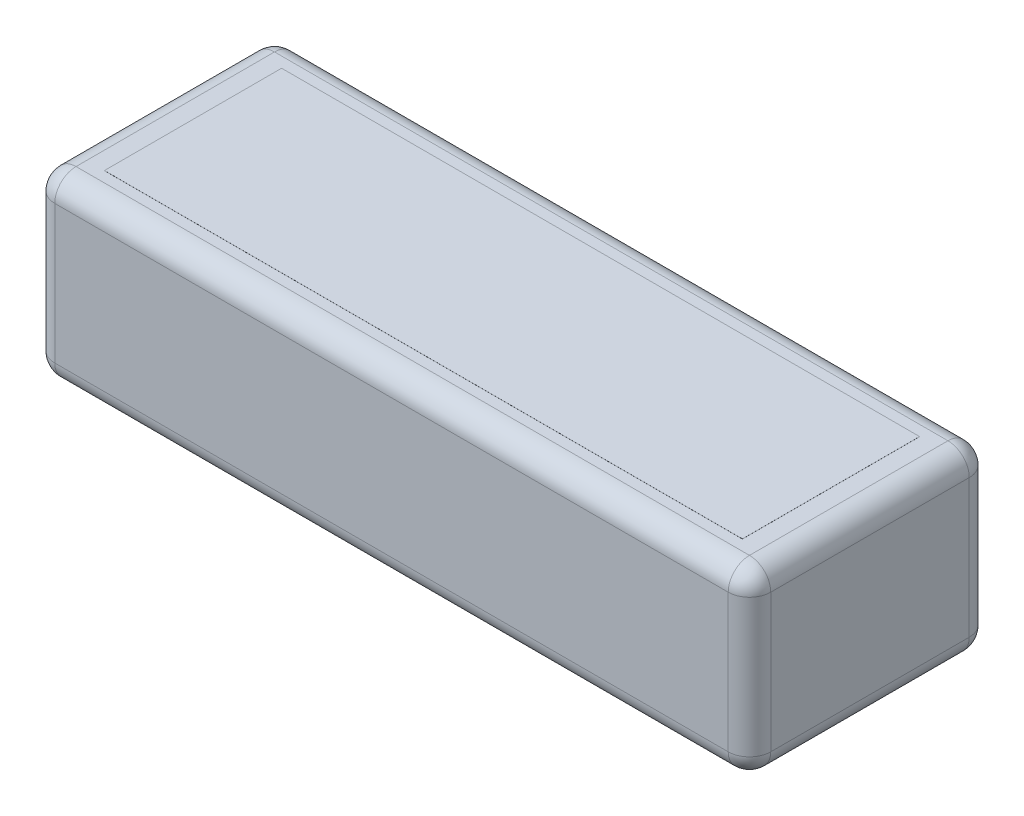
ISO-10303-21;
HEADER;
FILE_DESCRIPTION(('STEP AP214'),'2;1');
FILE_NAME('part.step','',(''),(''),'','','');
FILE_SCHEMA(('AUTOMOTIVE_DESIGN { 1 0 10303 214 1 1 1 1 }'));
ENDSEC;
DATA;
#1=APPLICATION_CONTEXT('core data for automotive mechanical design processes');
#2=APPLICATION_PROTOCOL_DEFINITION('international standard','automotive_design',2000,#1);
#3=PRODUCT_CONTEXT('',#1,'mechanical');
#4=PRODUCT('Part','Part','',(#3));
#5=PRODUCT_RELATED_PRODUCT_CATEGORY('part','',(#4));
#6=PRODUCT_DEFINITION_FORMATION('','',#4);
#7=PRODUCT_DEFINITION_CONTEXT('part definition',#1,'design');
#8=PRODUCT_DEFINITION('design','',#6,#7);
#9=PRODUCT_DEFINITION_SHAPE('','',#8);
#10=(LENGTH_UNIT() NAMED_UNIT(*) SI_UNIT(.MILLI.,.METRE.));
#11=(NAMED_UNIT(*) PLANE_ANGLE_UNIT() SI_UNIT($,.RADIAN.));
#12=(NAMED_UNIT(*) SI_UNIT($,.STERADIAN.) SOLID_ANGLE_UNIT());
#13=UNCERTAINTY_MEASURE_WITH_UNIT(LENGTH_MEASURE(1.E-05),#10,'distance_accuracy_value','');
#14=(GEOMETRIC_REPRESENTATION_CONTEXT(3) GLOBAL_UNCERTAINTY_ASSIGNED_CONTEXT((#13)) GLOBAL_UNIT_ASSIGNED_CONTEXT((#10,
#11,#12)) REPRESENTATION_CONTEXT('',''));
#15=CARTESIAN_POINT('',(0.,0.,0.));
#16=DIRECTION('',(0.,0.,1.));
#17=DIRECTION('',(1.,0.,0.));
#18=AXIS2_PLACEMENT_3D('',#15,#16,#17);
#19=CARTESIAN_POINT('',(0.,25.5,0.));
#20=DIRECTION('',(0.,1.,0.));
#21=DIRECTION('',(0.,0.,1.));
#22=AXIS2_PLACEMENT_3D('',#19,#20,#21);
#23=PLANE('',#22);
#24=DIRECTION('',(-1.,0.,0.));
#25=VECTOR('',#24,1.);
#26=CARTESIAN_POINT('',(-50.5,25.5,-14.));
#27=LINE('',#26,#25);
#28=CARTESIAN_POINT('',(47.5,25.5,-14.));
#29=VERTEX_POINT('',#28);
#30=CARTESIAN_POINT('',(-47.5,25.5,-14.));
#31=VERTEX_POINT('',#30);
#32=EDGE_CURVE('E41',#29,#31,#27,.T.);
#33=ORIENTED_EDGE('',*,*,#32,.T.);
#34=DIRECTION('',(0.,0.,1.));
#35=VECTOR('',#34,1.);
#36=CARTESIAN_POINT('',(-47.5,25.5,17.));
#37=LINE('',#36,#35);
#38=CARTESIAN_POINT('',(-47.5,25.5,14.));
#39=VERTEX_POINT('',#38);
#40=EDGE_CURVE('E11',#31,#39,#37,.T.);
#41=ORIENTED_EDGE('',*,*,#40,.T.);
#42=DIRECTION('',(1.,0.,0.));
#43=VECTOR('',#42,1.);
#44=CARTESIAN_POINT('',(50.5,25.5,14.));
#45=LINE('',#44,#43);
#46=CARTESIAN_POINT('',(47.5,25.5,14.));
#47=VERTEX_POINT('',#46);
#48=EDGE_CURVE('E219',#39,#47,#45,.T.);
#49=ORIENTED_EDGE('',*,*,#48,.T.);
#50=DIRECTION('',(0.,0.,-1.));
#51=VECTOR('',#50,1.);
#52=CARTESIAN_POINT('',(47.5,25.5,-17.));
#53=LINE('',#52,#51);
#54=EDGE_CURVE('E52',#47,#29,#53,.T.);
#55=ORIENTED_EDGE('',*,*,#54,.T.);
#56=EDGE_LOOP('',(#33,#41,#49,#55));
#57=FACE_BOUND('',#56,.T.);
#58=DIRECTION('',(1.,0.,0.));
#59=VECTOR('',#58,1.);
#60=CARTESIAN_POINT('',(45.,25.5,12.5));
#61=LINE('',#60,#59);
#62=CARTESIAN_POINT('',(-45.,25.5,12.5));
#63=VERTEX_POINT('',#62);
#64=CARTESIAN_POINT('',(45.,25.5,12.5));
#65=VERTEX_POINT('',#64);
#66=EDGE_CURVE('E294',#63,#65,#61,.T.);
#67=ORIENTED_EDGE('',*,*,#66,.F.);
#68=DIRECTION('',(0.,0.,1.));
#69=VECTOR('',#68,1.);
#70=CARTESIAN_POINT('',(-45.,25.5,12.5));
#71=LINE('',#70,#69);
#72=CARTESIAN_POINT('',(-45.,25.5,-12.5));
#73=VERTEX_POINT('',#72);
#74=EDGE_CURVE('E167',#73,#63,#71,.T.);
#75=ORIENTED_EDGE('',*,*,#74,.F.);
#76=DIRECTION('',(-1.,0.,0.));
#77=VECTOR('',#76,1.);
#78=CARTESIAN_POINT('',(45.,25.5,-12.5));
#79=LINE('',#78,#77);
#80=CARTESIAN_POINT('',(45.,25.5,-12.5));
#81=VERTEX_POINT('',#80);
#82=EDGE_CURVE('E163',#81,#73,#79,.T.);
#83=ORIENTED_EDGE('',*,*,#82,.F.);
#84=DIRECTION('',(0.,0.,-1.));
#85=VECTOR('',#84,1.);
#86=CARTESIAN_POINT('',(45.,25.5,12.5));
#87=LINE('',#86,#85);
#88=EDGE_CURVE('E296',#65,#81,#87,.T.);
#89=ORIENTED_EDGE('',*,*,#88,.F.);
#90=EDGE_LOOP('',(#67,#75,#83,#89));
#91=FACE_BOUND('',#90,.T.);
#92=ADVANCED_FACE('F32',(#57,#91),#23,.T.);
#93=CARTESIAN_POINT('',(-50.5,25.5,17.));
#94=DIRECTION('',(1.,0.,0.));
#95=DIRECTION('',(0.,0.,-1.));
#96=AXIS2_PLACEMENT_3D('',#93,#94,#95);
#97=PLANE('',#96);
#98=DIRECTION('',(0.,-1.,0.));
#99=VECTOR('',#98,1.);
#100=CARTESIAN_POINT('',(-50.5,25.5,-14.));
#101=LINE('',#100,#99);
#102=CARTESIAN_POINT('',(-50.5,22.5,-14.));
#103=VERTEX_POINT('',#102);
#104=CARTESIAN_POINT('',(-50.5,3.,-14.));
#105=VERTEX_POINT('',#104);
#106=EDGE_CURVE('E212',#103,#105,#101,.T.);
#107=ORIENTED_EDGE('',*,*,#106,.T.);
#108=DIRECTION('',(0.,0.,1.));
#109=VECTOR('',#108,1.);
#110=CARTESIAN_POINT('',(-50.5,3.,17.));
#111=LINE('',#110,#109);
#112=CARTESIAN_POINT('',(-50.5,3.,14.));
#113=VERTEX_POINT('',#112);
#114=EDGE_CURVE('E216',#105,#113,#111,.T.);
#115=ORIENTED_EDGE('',*,*,#114,.T.);
#116=DIRECTION('',(0.,-1.,0.));
#117=VECTOR('',#116,1.);
#118=CARTESIAN_POINT('',(-50.5,25.5,14.));
#119=LINE('',#118,#117);
#120=CARTESIAN_POINT('',(-50.5,22.5,14.));
#121=VERTEX_POINT('',#120);
#122=EDGE_CURVE('E214',#113,#121,#119,.F.);
#123=ORIENTED_EDGE('',*,*,#122,.T.);
#124=DIRECTION('',(0.,0.,1.));
#125=VECTOR('',#124,1.);
#126=CARTESIAN_POINT('',(-50.5,22.5,-17.));
#127=LINE('',#126,#125);
#128=EDGE_CURVE('E210',#121,#103,#127,.F.);
#129=ORIENTED_EDGE('',*,*,#128,.T.);
#130=EDGE_LOOP('',(#107,#115,#123,#129));
#131=FACE_BOUND('',#130,.T.);
#132=ADVANCED_FACE('F314',(#131),#97,.F.);
#133=CARTESIAN_POINT('',(50.5,25.5,17.));
#134=DIRECTION('',(0.,0.,-1.));
#135=DIRECTION('',(-1.,0.,0.));
#136=AXIS2_PLACEMENT_3D('',#133,#134,#135);
#137=PLANE('',#136);
#138=DIRECTION('',(0.,-1.,0.));
#139=VECTOR('',#138,1.);
#140=CARTESIAN_POINT('',(-47.5,25.5,17.));
#141=LINE('',#140,#139);
#142=CARTESIAN_POINT('',(-47.5,22.5,17.));
#143=VERTEX_POINT('',#142);
#144=CARTESIAN_POINT('',(-47.5,3.,17.));
#145=VERTEX_POINT('',#144);
#146=EDGE_CURVE('E205',#143,#145,#141,.T.);
#147=ORIENTED_EDGE('',*,*,#146,.T.);
#148=DIRECTION('',(1.,0.,0.));
#149=VECTOR('',#148,1.);
#150=CARTESIAN_POINT('',(50.5,3.,17.));
#151=LINE('',#150,#149);
#152=CARTESIAN_POINT('',(47.5,3.,17.));
#153=VERTEX_POINT('',#152);
#154=EDGE_CURVE('E207',#145,#153,#151,.T.);
#155=ORIENTED_EDGE('',*,*,#154,.T.);
#156=DIRECTION('',(0.,-1.,0.));
#157=VECTOR('',#156,1.);
#158=CARTESIAN_POINT('',(47.5,25.5,17.));
#159=LINE('',#158,#157);
#160=CARTESIAN_POINT('',(47.5,22.5,17.));
#161=VERTEX_POINT('',#160);
#162=EDGE_CURVE('E203',#153,#161,#159,.F.);
#163=ORIENTED_EDGE('',*,*,#162,.T.);
#164=DIRECTION('',(1.,0.,0.));
#165=VECTOR('',#164,1.);
#166=CARTESIAN_POINT('',(-50.5,22.5,17.));
#167=LINE('',#166,#165);
#168=EDGE_CURVE('E201',#161,#143,#167,.F.);
#169=ORIENTED_EDGE('',*,*,#168,.T.);
#170=EDGE_LOOP('',(#147,#155,#163,#169));
#171=FACE_BOUND('',#170,.T.);
#172=ADVANCED_FACE('F319',(#171),#137,.F.);
#173=CARTESIAN_POINT('',(50.5,25.5,17.));
#174=DIRECTION('',(-1.,0.,0.));
#175=DIRECTION('',(0.,0.,1.));
#176=AXIS2_PLACEMENT_3D('',#173,#174,#175);
#177=PLANE('',#176);
#178=DIRECTION('',(0.,-1.,0.));
#179=VECTOR('',#178,1.);
#180=CARTESIAN_POINT('',(50.5,25.5,14.));
#181=LINE('',#180,#179);
#182=CARTESIAN_POINT('',(50.5,22.5,14.));
#183=VERTEX_POINT('',#182);
#184=CARTESIAN_POINT('',(50.5,3.,14.));
#185=VERTEX_POINT('',#184);
#186=EDGE_CURVE('E194',#183,#185,#181,.T.);
#187=ORIENTED_EDGE('',*,*,#186,.T.);
#188=DIRECTION('',(0.,0.,-1.));
#189=VECTOR('',#188,1.);
#190=CARTESIAN_POINT('',(50.5,3.,17.));
#191=LINE('',#190,#189);
#192=CARTESIAN_POINT('',(50.5,3.,-14.));
#193=VERTEX_POINT('',#192);
#194=EDGE_CURVE('E198',#185,#193,#191,.T.);
#195=ORIENTED_EDGE('',*,*,#194,.T.);
#196=DIRECTION('',(0.,-1.,0.));
#197=VECTOR('',#196,1.);
#198=CARTESIAN_POINT('',(50.5,25.5,-14.));
#199=LINE('',#198,#197);
#200=CARTESIAN_POINT('',(50.5,22.5,-14.));
#201=VERTEX_POINT('',#200);
#202=EDGE_CURVE('E196',#193,#201,#199,.F.);
#203=ORIENTED_EDGE('',*,*,#202,.T.);
#204=DIRECTION('',(0.,0.,-1.));
#205=VECTOR('',#204,1.);
#206=CARTESIAN_POINT('',(50.5,22.5,17.));
#207=LINE('',#206,#205);
#208=EDGE_CURVE('E192',#201,#183,#207,.F.);
#209=ORIENTED_EDGE('',*,*,#208,.T.);
#210=EDGE_LOOP('',(#187,#195,#203,#209));
#211=FACE_BOUND('',#210,.T.);
#212=ADVANCED_FACE('F332',(#211),#177,.F.);
#213=CARTESIAN_POINT('',(50.5,25.5,-17.));
#214=DIRECTION('',(0.,0.,1.));
#215=DIRECTION('',(1.,0.,0.));
#216=AXIS2_PLACEMENT_3D('',#213,#214,#215);
#217=PLANE('',#216);
#218=DIRECTION('',(0.,-1.,0.));
#219=VECTOR('',#218,1.);
#220=CARTESIAN_POINT('',(47.5,25.5,-17.));
#221=LINE('',#220,#219);
#222=CARTESIAN_POINT('',(47.5,22.5,-17.));
#223=VERTEX_POINT('',#222);
#224=CARTESIAN_POINT('',(47.5,3.,-17.));
#225=VERTEX_POINT('',#224);
#226=EDGE_CURVE('E171',#223,#225,#221,.T.);
#227=ORIENTED_EDGE('',*,*,#226,.T.);
#228=DIRECTION('',(-1.,0.,0.));
#229=VECTOR('',#228,1.);
#230=CARTESIAN_POINT('',(50.5,3.,-17.));
#231=LINE('',#230,#229);
#232=CARTESIAN_POINT('',(-47.5,3.,-17.));
#233=VERTEX_POINT('',#232);
#234=EDGE_CURVE('E180',#225,#233,#231,.T.);
#235=ORIENTED_EDGE('',*,*,#234,.T.);
#236=DIRECTION('',(0.,-1.,0.));
#237=VECTOR('',#236,1.);
#238=CARTESIAN_POINT('',(-47.5,25.5,-17.));
#239=LINE('',#238,#237);
#240=CARTESIAN_POINT('',(-47.5,22.5,-17.));
#241=VERTEX_POINT('',#240);
#242=EDGE_CURVE('E178',#233,#241,#239,.F.);
#243=ORIENTED_EDGE('',*,*,#242,.T.);
#244=DIRECTION('',(-1.,0.,0.));
#245=VECTOR('',#244,1.);
#246=CARTESIAN_POINT('',(50.5,22.5,-17.));
#247=LINE('',#246,#245);
#248=EDGE_CURVE('E169',#241,#223,#247,.F.);
#249=ORIENTED_EDGE('',*,*,#248,.T.);
#250=EDGE_LOOP('',(#227,#235,#243,#249));
#251=FACE_BOUND('',#250,.T.);
#252=ADVANCED_FACE('F328',(#251),#217,.F.);
#253=CARTESIAN_POINT('',(0.,0.,0.));
#254=DIRECTION('',(0.,1.,0.));
#255=DIRECTION('',(0.,0.,1.));
#256=AXIS2_PLACEMENT_3D('',#253,#254,#255);
#257=PLANE('',#256);
#258=DIRECTION('',(0.,0.,1.));
#259=VECTOR('',#258,1.);
#260=CARTESIAN_POINT('',(-47.5,0.,0.));
#261=LINE('',#260,#259);
#262=CARTESIAN_POINT('',(-47.5,0.,14.));
#263=VERTEX_POINT('',#262);
#264=CARTESIAN_POINT('',(-47.5,0.,-14.));
#265=VERTEX_POINT('',#264);
#266=EDGE_CURVE('E183',#263,#265,#261,.F.);
#267=ORIENTED_EDGE('',*,*,#266,.T.);
#268=DIRECTION('',(-1.,0.,0.));
#269=VECTOR('',#268,1.);
#270=CARTESIAN_POINT('',(0.,0.,-14.));
#271=LINE('',#270,#269);
#272=CARTESIAN_POINT('',(47.5,0.,-14.));
#273=VERTEX_POINT('',#272);
#274=EDGE_CURVE('E189',#265,#273,#271,.F.);
#275=ORIENTED_EDGE('',*,*,#274,.T.);
#276=DIRECTION('',(0.,0.,-1.));
#277=VECTOR('',#276,1.);
#278=CARTESIAN_POINT('',(47.5,0.,0.));
#279=LINE('',#278,#277);
#280=CARTESIAN_POINT('',(47.5,0.,14.));
#281=VERTEX_POINT('',#280);
#282=EDGE_CURVE('E187',#273,#281,#279,.F.);
#283=ORIENTED_EDGE('',*,*,#282,.T.);
#284=DIRECTION('',(1.,0.,0.));
#285=VECTOR('',#284,1.);
#286=CARTESIAN_POINT('',(0.,0.,14.));
#287=LINE('',#286,#285);
#288=EDGE_CURVE('E185',#281,#263,#287,.F.);
#289=ORIENTED_EDGE('',*,*,#288,.T.);
#290=EDGE_LOOP('',(#267,#275,#283,#289));
#291=FACE_BOUND('',#290,.T.);
#292=ADVANCED_FACE('F325',(#291),#257,.F.);
#293=CARTESIAN_POINT('',(-45.,25.51,12.5));
#294=DIRECTION('',(1.,0.,0.));
#295=DIRECTION('',(0.,0.,-1.));
#296=AXIS2_PLACEMENT_3D('',#293,#294,#295);
#297=PLANE('',#296);
#298=ORIENTED_EDGE('',*,*,#74,.T.);
#299=DIRECTION('',(0.,-1.,0.));
#300=VECTOR('',#299,1.);
#301=CARTESIAN_POINT('',(-45.,25.51,12.5));
#302=LINE('',#301,#300);
#303=CARTESIAN_POINT('',(-45.,25.51,12.5));
#304=VERTEX_POINT('',#303);
#305=EDGE_CURVE('E147',#304,#63,#302,.T.);
#306=ORIENTED_EDGE('',*,*,#305,.F.);
#307=DIRECTION('',(0.,0.,1.));
#308=VECTOR('',#307,1.);
#309=CARTESIAN_POINT('',(-45.,25.51,12.5));
#310=LINE('',#309,#308);
#311=CARTESIAN_POINT('',(-45.,25.51,-12.5));
#312=VERTEX_POINT('',#311);
#313=EDGE_CURVE('E154',#312,#304,#310,.T.);
#314=ORIENTED_EDGE('',*,*,#313,.F.);
#315=DIRECTION('',(0.,-1.,0.));
#316=VECTOR('',#315,1.);
#317=CARTESIAN_POINT('',(-45.,25.51,-12.5));
#318=LINE('',#317,#316);
#319=EDGE_CURVE('E304',#312,#73,#318,.T.);
#320=ORIENTED_EDGE('',*,*,#319,.T.);
#321=EDGE_LOOP('',(#298,#306,#314,#320));
#322=FACE_BOUND('',#321,.T.);
#323=ADVANCED_FACE('F165',(#322),#297,.F.);
#324=CARTESIAN_POINT('',(45.,25.51,12.5));
#325=DIRECTION('',(0.,0.,-1.));
#326=DIRECTION('',(-1.,0.,0.));
#327=AXIS2_PLACEMENT_3D('',#324,#325,#326);
#328=PLANE('',#327);
#329=ORIENTED_EDGE('',*,*,#66,.T.);
#330=DIRECTION('',(0.,-1.,0.));
#331=VECTOR('',#330,1.);
#332=CARTESIAN_POINT('',(45.,25.51,12.5));
#333=LINE('',#332,#331);
#334=CARTESIAN_POINT('',(45.,25.51,12.5));
#335=VERTEX_POINT('',#334);
#336=EDGE_CURVE('E150',#335,#65,#333,.T.);
#337=ORIENTED_EDGE('',*,*,#336,.F.);
#338=DIRECTION('',(1.,0.,0.));
#339=VECTOR('',#338,1.);
#340=CARTESIAN_POINT('',(45.,25.51,12.5));
#341=LINE('',#340,#339);
#342=EDGE_CURVE('E143',#304,#335,#341,.T.);
#343=ORIENTED_EDGE('',*,*,#342,.F.);
#344=ORIENTED_EDGE('',*,*,#305,.T.);
#345=EDGE_LOOP('',(#329,#337,#343,#344));
#346=FACE_BOUND('',#345,.T.);
#347=ADVANCED_FACE('F145',(#346),#328,.F.);
#348=CARTESIAN_POINT('',(45.,25.51,12.5));
#349=DIRECTION('',(-1.,0.,0.));
#350=DIRECTION('',(0.,0.,1.));
#351=AXIS2_PLACEMENT_3D('',#348,#349,#350);
#352=PLANE('',#351);
#353=ORIENTED_EDGE('',*,*,#88,.T.);
#354=DIRECTION('',(0.,-1.,0.));
#355=VECTOR('',#354,1.);
#356=CARTESIAN_POINT('',(45.,25.51,-12.5));
#357=LINE('',#356,#355);
#358=CARTESIAN_POINT('',(45.,25.51,-12.5));
#359=VERTEX_POINT('',#358);
#360=EDGE_CURVE('E173',#359,#81,#357,.T.);
#361=ORIENTED_EDGE('',*,*,#360,.F.);
#362=DIRECTION('',(0.,0.,-1.));
#363=VECTOR('',#362,1.);
#364=CARTESIAN_POINT('',(45.,25.51,12.5));
#365=LINE('',#364,#363);
#366=EDGE_CURVE('E153',#335,#359,#365,.T.);
#367=ORIENTED_EDGE('',*,*,#366,.F.);
#368=ORIENTED_EDGE('',*,*,#336,.T.);
#369=EDGE_LOOP('',(#353,#361,#367,#368));
#370=FACE_BOUND('',#369,.T.);
#371=ADVANCED_FACE('F311',(#370),#352,.F.);
#372=CARTESIAN_POINT('',(45.,25.51,-12.5));
#373=DIRECTION('',(0.,0.,1.));
#374=DIRECTION('',(1.,0.,0.));
#375=AXIS2_PLACEMENT_3D('',#372,#373,#374);
#376=PLANE('',#375);
#377=ORIENTED_EDGE('',*,*,#82,.T.);
#378=ORIENTED_EDGE('',*,*,#319,.F.);
#379=DIRECTION('',(-1.,0.,0.));
#380=VECTOR('',#379,1.);
#381=CARTESIAN_POINT('',(45.,25.51,-12.5));
#382=LINE('',#381,#380);
#383=EDGE_CURVE('E159',#359,#312,#382,.T.);
#384=ORIENTED_EDGE('',*,*,#383,.F.);
#385=ORIENTED_EDGE('',*,*,#360,.T.);
#386=EDGE_LOOP('',(#377,#378,#384,#385));
#387=FACE_BOUND('',#386,.T.);
#388=ADVANCED_FACE('F307',(#387),#376,.F.);
#389=CARTESIAN_POINT('',(0.,25.51,0.));
#390=DIRECTION('',(0.,1.,0.));
#391=DIRECTION('',(0.,0.,1.));
#392=AXIS2_PLACEMENT_3D('',#389,#390,#391);
#393=PLANE('',#392);
#394=ORIENTED_EDGE('',*,*,#313,.T.);
#395=ORIENTED_EDGE('',*,*,#342,.T.);
#396=ORIENTED_EDGE('',*,*,#366,.T.);
#397=ORIENTED_EDGE('',*,*,#383,.T.);
#398=EDGE_LOOP('',(#394,#395,#396,#397));
#399=FACE_BOUND('',#398,.T.);
#400=ADVANCED_FACE('F157',(#399),#393,.T.);
#401=CARTESIAN_POINT('',(0.,22.5,14.));
#402=DIRECTION('',(-1.,0.,0.));
#403=DIRECTION('',(0.,0.,1.));
#404=AXIS2_PLACEMENT_3D('',#401,#402,#403);
#405=CYLINDRICAL_SURFACE('',#404,3.);
#406=CARTESIAN_POINT('',(47.5,22.5,14.));
#407=DIRECTION('',(1.,0.,0.));
#408=DIRECTION('',(0.,0.,-1.));
#409=AXIS2_PLACEMENT_3D('',#406,#407,#408);
#410=CIRCLE('',#409,3.);
#411=EDGE_CURVE('E36',#47,#161,#410,.T.);
#412=ORIENTED_EDGE('',*,*,#411,.F.);
#413=ORIENTED_EDGE('',*,*,#48,.F.);
#414=CARTESIAN_POINT('',(-47.5,22.5,14.));
#415=DIRECTION('',(-1.,0.,0.));
#416=DIRECTION('',(0.,0.,1.));
#417=AXIS2_PLACEMENT_3D('',#414,#415,#416);
#418=CIRCLE('',#417,3.);
#419=EDGE_CURVE('E282',#143,#39,#418,.T.);
#420=ORIENTED_EDGE('',*,*,#419,.F.);
#421=ORIENTED_EDGE('',*,*,#168,.F.);
#422=EDGE_LOOP('',(#412,#413,#420,#421));
#423=FACE_BOUND('',#422,.T.);
#424=ADVANCED_FACE('F34',(#423),#405,.T.);
#425=CARTESIAN_POINT('',(47.5,22.5,14.));
#426=DIRECTION('',(0.,0.,1.));
#427=DIRECTION('',(1.,0.,0.));
#428=AXIS2_PLACEMENT_3D('',#425,#426,#427);
#429=SPHERICAL_SURFACE('',#428,3.);
#430=CARTESIAN_POINT('',(47.5,22.5,14.));
#431=DIRECTION('',(0.,0.,1.));
#432=DIRECTION('',(1.,0.,0.));
#433=AXIS2_PLACEMENT_3D('',#430,#431,#432);
#434=CIRCLE('',#433,3.);
#435=EDGE_CURVE('E277',#47,#183,#434,.F.);
#436=ORIENTED_EDGE('',*,*,#435,.F.);
#437=ORIENTED_EDGE('',*,*,#411,.T.);
#438=CARTESIAN_POINT('',(47.5,22.5,14.));
#439=DIRECTION('',(0.,1.,0.));
#440=DIRECTION('',(0.,0.,1.));
#441=AXIS2_PLACEMENT_3D('',#438,#439,#440);
#442=CIRCLE('',#441,3.);
#443=EDGE_CURVE('E280',#183,#161,#442,.F.);
#444=ORIENTED_EDGE('',*,*,#443,.F.);
#445=EDGE_LOOP('',(#436,#437,#444));
#446=FACE_BOUND('',#445,.T.);
#447=ADVANCED_FACE('F410',(#446),#429,.T.);
#448=CARTESIAN_POINT('',(-47.5,22.5,14.));
#449=DIRECTION('',(0.,0.,1.));
#450=DIRECTION('',(1.,0.,0.));
#451=AXIS2_PLACEMENT_3D('',#448,#449,#450);
#452=SPHERICAL_SURFACE('',#451,3.);
#453=CARTESIAN_POINT('',(-47.5,22.5,14.));
#454=DIRECTION('',(0.,1.,0.));
#455=DIRECTION('',(0.,0.,1.));
#456=AXIS2_PLACEMENT_3D('',#453,#454,#455);
#457=CIRCLE('',#456,3.);
#458=EDGE_CURVE('E272',#143,#121,#457,.F.);
#459=ORIENTED_EDGE('',*,*,#458,.F.);
#460=ORIENTED_EDGE('',*,*,#419,.T.);
#461=CARTESIAN_POINT('',(-47.5,22.5,14.));
#462=DIRECTION('',(0.,0.,1.));
#463=DIRECTION('',(1.,0.,0.));
#464=AXIS2_PLACEMENT_3D('',#461,#462,#463);
#465=CIRCLE('',#464,3.);
#466=EDGE_CURVE('E275',#121,#39,#465,.F.);
#467=ORIENTED_EDGE('',*,*,#466,.F.);
#468=EDGE_LOOP('',(#459,#460,#467));
#469=FACE_BOUND('',#468,.T.);
#470=ADVANCED_FACE('F407',(#469),#452,.T.);
#471=CARTESIAN_POINT('',(47.5,25.5,14.));
#472=DIRECTION('',(0.,-1.,0.));
#473=DIRECTION('',(0.,0.,-1.));
#474=AXIS2_PLACEMENT_3D('',#471,#472,#473);
#475=CYLINDRICAL_SURFACE('',#474,3.);
#476=ORIENTED_EDGE('',*,*,#443,.T.);
#477=ORIENTED_EDGE('',*,*,#162,.F.);
#478=CARTESIAN_POINT('',(47.5,3.,14.));
#479=DIRECTION('',(0.,-1.,0.));
#480=DIRECTION('',(0.,0.,-1.));
#481=AXIS2_PLACEMENT_3D('',#478,#479,#480);
#482=CIRCLE('',#481,3.);
#483=EDGE_CURVE('E267',#185,#153,#482,.T.);
#484=ORIENTED_EDGE('',*,*,#483,.F.);
#485=ORIENTED_EDGE('',*,*,#186,.F.);
#486=EDGE_LOOP('',(#476,#477,#484,#485));
#487=FACE_BOUND('',#486,.T.);
#488=ADVANCED_FACE('F403',(#487),#475,.T.);
#489=CARTESIAN_POINT('',(47.5,22.5,0.));
#490=DIRECTION('',(0.,0.,1.));
#491=DIRECTION('',(1.,0.,0.));
#492=AXIS2_PLACEMENT_3D('',#489,#490,#491);
#493=CYLINDRICAL_SURFACE('',#492,3.);
#494=ORIENTED_EDGE('',*,*,#435,.T.);
#495=ORIENTED_EDGE('',*,*,#208,.F.);
#496=CARTESIAN_POINT('',(47.5,22.5,-14.));
#497=DIRECTION('',(0.,0.,-1.));
#498=DIRECTION('',(-1.,0.,0.));
#499=AXIS2_PLACEMENT_3D('',#496,#497,#498);
#500=CIRCLE('',#499,3.);
#501=EDGE_CURVE('E264',#29,#201,#500,.T.);
#502=ORIENTED_EDGE('',*,*,#501,.F.);
#503=ORIENTED_EDGE('',*,*,#54,.F.);
#504=EDGE_LOOP('',(#494,#495,#502,#503));
#505=FACE_BOUND('',#504,.T.);
#506=ADVANCED_FACE('F399',(#505),#493,.T.);
#507=CARTESIAN_POINT('',(0.,22.5,-14.));
#508=DIRECTION('',(1.,0.,0.));
#509=DIRECTION('',(0.,0.,-1.));
#510=AXIS2_PLACEMENT_3D('',#507,#508,#509);
#511=CYLINDRICAL_SURFACE('',#510,3.);
#512=CARTESIAN_POINT('',(-47.5,22.5,-14.));
#513=DIRECTION('',(-1.,0.,0.));
#514=DIRECTION('',(0.,0.,1.));
#515=AXIS2_PLACEMENT_3D('',#512,#513,#514);
#516=CIRCLE('',#515,3.);
#517=EDGE_CURVE('E258',#31,#241,#516,.T.);
#518=ORIENTED_EDGE('',*,*,#517,.F.);
#519=ORIENTED_EDGE('',*,*,#32,.F.);
#520=CARTESIAN_POINT('',(47.5,22.5,-14.));
#521=DIRECTION('',(1.,0.,0.));
#522=DIRECTION('',(0.,0.,-1.));
#523=AXIS2_PLACEMENT_3D('',#520,#521,#522);
#524=CIRCLE('',#523,3.);
#525=EDGE_CURVE('E261',#223,#29,#524,.T.);
#526=ORIENTED_EDGE('',*,*,#525,.F.);
#527=ORIENTED_EDGE('',*,*,#248,.F.);
#528=EDGE_LOOP('',(#518,#519,#526,#527));
#529=FACE_BOUND('',#528,.T.);
#530=ADVANCED_FACE('F395',(#529),#511,.T.);
#531=CARTESIAN_POINT('',(-47.5,22.5,0.));
#532=DIRECTION('',(0.,0.,-1.));
#533=DIRECTION('',(-1.,0.,0.));
#534=AXIS2_PLACEMENT_3D('',#531,#532,#533);
#535=CYLINDRICAL_SURFACE('',#534,3.);
#536=ORIENTED_EDGE('',*,*,#466,.T.);
#537=ORIENTED_EDGE('',*,*,#40,.F.);
#538=CARTESIAN_POINT('',(-47.5,22.5,-14.));
#539=DIRECTION('',(0.,0.,-1.));
#540=DIRECTION('',(-1.,0.,0.));
#541=AXIS2_PLACEMENT_3D('',#538,#539,#540);
#542=CIRCLE('',#541,3.);
#543=EDGE_CURVE('E255',#103,#31,#542,.T.);
#544=ORIENTED_EDGE('',*,*,#543,.F.);
#545=ORIENTED_EDGE('',*,*,#128,.F.);
#546=EDGE_LOOP('',(#536,#537,#544,#545));
#547=FACE_BOUND('',#546,.T.);
#548=ADVANCED_FACE('F391',(#547),#535,.T.);
#549=CARTESIAN_POINT('',(-47.5,25.5,14.));
#550=DIRECTION('',(0.,-1.,0.));
#551=DIRECTION('',(0.,0.,-1.));
#552=AXIS2_PLACEMENT_3D('',#549,#550,#551);
#553=CYLINDRICAL_SURFACE('',#552,3.);
#554=ORIENTED_EDGE('',*,*,#458,.T.);
#555=ORIENTED_EDGE('',*,*,#122,.F.);
#556=CARTESIAN_POINT('',(-47.5,3.,14.));
#557=DIRECTION('',(0.,-1.,0.));
#558=DIRECTION('',(0.,0.,-1.));
#559=AXIS2_PLACEMENT_3D('',#556,#557,#558);
#560=CIRCLE('',#559,3.);
#561=EDGE_CURVE('E252',#145,#113,#560,.T.);
#562=ORIENTED_EDGE('',*,*,#561,.F.);
#563=ORIENTED_EDGE('',*,*,#146,.F.);
#564=EDGE_LOOP('',(#554,#555,#562,#563));
#565=FACE_BOUND('',#564,.T.);
#566=ADVANCED_FACE('F387',(#565),#553,.T.);
#567=CARTESIAN_POINT('',(50.5,3.,14.));
#568=DIRECTION('',(1.,0.,0.));
#569=DIRECTION('',(0.,0.,-1.));
#570=AXIS2_PLACEMENT_3D('',#567,#568,#569);
#571=CYLINDRICAL_SURFACE('',#570,3.);
#572=CARTESIAN_POINT('',(47.5,3.,14.));
#573=DIRECTION('',(1.,0.,0.));
#574=DIRECTION('',(0.,0.,-1.));
#575=AXIS2_PLACEMENT_3D('',#572,#573,#574);
#576=CIRCLE('',#575,3.);
#577=EDGE_CURVE('E269',#153,#281,#576,.T.);
#578=ORIENTED_EDGE('',*,*,#577,.F.);
#579=ORIENTED_EDGE('',*,*,#154,.F.);
#580=CARTESIAN_POINT('',(-47.5,3.,14.));
#581=DIRECTION('',(-1.,0.,0.));
#582=DIRECTION('',(0.,0.,1.));
#583=AXIS2_PLACEMENT_3D('',#580,#581,#582);
#584=CIRCLE('',#583,3.);
#585=EDGE_CURVE('E249',#263,#145,#584,.T.);
#586=ORIENTED_EDGE('',*,*,#585,.F.);
#587=ORIENTED_EDGE('',*,*,#288,.F.);
#588=EDGE_LOOP('',(#578,#579,#586,#587));
#589=FACE_BOUND('',#588,.T.);
#590=ADVANCED_FACE('F383',(#589),#571,.T.);
#591=CARTESIAN_POINT('',(47.5,3.,14.));
#592=DIRECTION('',(0.,0.,1.));
#593=DIRECTION('',(1.,0.,0.));
#594=AXIS2_PLACEMENT_3D('',#591,#592,#593);
#595=SPHERICAL_SURFACE('',#594,3.);
#596=ORIENTED_EDGE('',*,*,#483,.T.);
#597=ORIENTED_EDGE('',*,*,#577,.T.);
#598=CARTESIAN_POINT('',(47.5,3.,14.));
#599=DIRECTION('',(0.,0.,1.));
#600=DIRECTION('',(1.,0.,0.));
#601=AXIS2_PLACEMENT_3D('',#598,#599,#600);
#602=CIRCLE('',#601,3.);
#603=EDGE_CURVE('E246',#185,#281,#602,.F.);
#604=ORIENTED_EDGE('',*,*,#603,.F.);
#605=EDGE_LOOP('',(#596,#597,#604));
#606=FACE_BOUND('',#605,.T.);
#607=ADVANCED_FACE('F379',(#606),#595,.T.);
#608=CARTESIAN_POINT('',(47.5,22.5,-14.));
#609=DIRECTION('',(0.,0.,1.));
#610=DIRECTION('',(1.,0.,0.));
#611=AXIS2_PLACEMENT_3D('',#608,#609,#610);
#612=SPHERICAL_SURFACE('',#611,3.);
#613=ORIENTED_EDGE('',*,*,#525,.T.);
#614=ORIENTED_EDGE('',*,*,#501,.T.);
#615=CARTESIAN_POINT('',(47.5,22.5,-14.));
#616=DIRECTION('',(0.,1.,0.));
#617=DIRECTION('',(0.,0.,1.));
#618=AXIS2_PLACEMENT_3D('',#615,#616,#617);
#619=CIRCLE('',#618,3.);
#620=EDGE_CURVE('E243',#223,#201,#619,.F.);
#621=ORIENTED_EDGE('',*,*,#620,.F.);
#622=EDGE_LOOP('',(#613,#614,#621));
#623=FACE_BOUND('',#622,.T.);
#624=ADVANCED_FACE('F375',(#623),#612,.T.);
#625=CARTESIAN_POINT('',(-47.5,22.5,-14.));
#626=DIRECTION('',(0.,0.,1.));
#627=DIRECTION('',(1.,0.,0.));
#628=AXIS2_PLACEMENT_3D('',#625,#626,#627);
#629=SPHERICAL_SURFACE('',#628,3.);
#630=ORIENTED_EDGE('',*,*,#543,.T.);
#631=ORIENTED_EDGE('',*,*,#517,.T.);
#632=CARTESIAN_POINT('',(-47.5,22.5,-14.));
#633=DIRECTION('',(0.,1.,0.));
#634=DIRECTION('',(0.,0.,1.));
#635=AXIS2_PLACEMENT_3D('',#632,#633,#634);
#636=CIRCLE('',#635,3.);
#637=EDGE_CURVE('E240',#103,#241,#636,.F.);
#638=ORIENTED_EDGE('',*,*,#637,.F.);
#639=EDGE_LOOP('',(#630,#631,#638));
#640=FACE_BOUND('',#639,.T.);
#641=ADVANCED_FACE('F371',(#640),#629,.T.);
#642=CARTESIAN_POINT('',(-47.5,3.,14.));
#643=DIRECTION('',(0.,0.,1.));
#644=DIRECTION('',(1.,0.,0.));
#645=AXIS2_PLACEMENT_3D('',#642,#643,#644);
#646=SPHERICAL_SURFACE('',#645,3.);
#647=ORIENTED_EDGE('',*,*,#585,.T.);
#648=ORIENTED_EDGE('',*,*,#561,.T.);
#649=CARTESIAN_POINT('',(-47.5,3.,14.));
#650=DIRECTION('',(0.,0.,1.));
#651=DIRECTION('',(1.,0.,0.));
#652=AXIS2_PLACEMENT_3D('',#649,#650,#651);
#653=CIRCLE('',#652,3.);
#654=EDGE_CURVE('E238',#263,#113,#653,.F.);
#655=ORIENTED_EDGE('',*,*,#654,.F.);
#656=EDGE_LOOP('',(#647,#648,#655));
#657=FACE_BOUND('',#656,.T.);
#658=ADVANCED_FACE('F367',(#657),#646,.T.);
#659=CARTESIAN_POINT('',(47.5,3.,17.));
#660=DIRECTION('',(0.,0.,-1.));
#661=DIRECTION('',(-1.,0.,0.));
#662=AXIS2_PLACEMENT_3D('',#659,#660,#661);
#663=CYLINDRICAL_SURFACE('',#662,3.);
#664=ORIENTED_EDGE('',*,*,#603,.T.);
#665=ORIENTED_EDGE('',*,*,#282,.F.);
#666=CARTESIAN_POINT('',(47.5,3.,-14.));
#667=DIRECTION('',(0.,0.,-1.));
#668=DIRECTION('',(-1.,0.,0.));
#669=AXIS2_PLACEMENT_3D('',#666,#667,#668);
#670=CIRCLE('',#669,3.);
#671=EDGE_CURVE('E235',#193,#273,#670,.T.);
#672=ORIENTED_EDGE('',*,*,#671,.F.);
#673=ORIENTED_EDGE('',*,*,#194,.F.);
#674=EDGE_LOOP('',(#664,#665,#672,#673));
#675=FACE_BOUND('',#674,.T.);
#676=ADVANCED_FACE('F363',(#675),#663,.T.);
#677=CARTESIAN_POINT('',(47.5,25.5,-14.));
#678=DIRECTION('',(0.,-1.,0.));
#679=DIRECTION('',(0.,0.,-1.));
#680=AXIS2_PLACEMENT_3D('',#677,#678,#679);
#681=CYLINDRICAL_SURFACE('',#680,3.);
#682=ORIENTED_EDGE('',*,*,#620,.T.);
#683=ORIENTED_EDGE('',*,*,#202,.F.);
#684=CARTESIAN_POINT('',(47.5,3.,-14.));
#685=DIRECTION('',(0.,-1.,0.));
#686=DIRECTION('',(0.,0.,-1.));
#687=AXIS2_PLACEMENT_3D('',#684,#685,#686);
#688=CIRCLE('',#687,3.);
#689=EDGE_CURVE('E233',#225,#193,#688,.T.);
#690=ORIENTED_EDGE('',*,*,#689,.F.);
#691=ORIENTED_EDGE('',*,*,#226,.F.);
#692=EDGE_LOOP('',(#682,#683,#690,#691));
#693=FACE_BOUND('',#692,.T.);
#694=ADVANCED_FACE('F359',(#693),#681,.T.);
#695=CARTESIAN_POINT('',(-47.5,25.5,-14.));
#696=DIRECTION('',(0.,-1.,0.));
#697=DIRECTION('',(0.,0.,-1.));
#698=AXIS2_PLACEMENT_3D('',#695,#696,#697);
#699=CYLINDRICAL_SURFACE('',#698,3.);
#700=ORIENTED_EDGE('',*,*,#637,.T.);
#701=ORIENTED_EDGE('',*,*,#242,.F.);
#702=CARTESIAN_POINT('',(-47.5,3.,-14.));
#703=DIRECTION('',(0.,-1.,0.));
#704=DIRECTION('',(0.,0.,-1.));
#705=AXIS2_PLACEMENT_3D('',#702,#703,#704);
#706=CIRCLE('',#705,3.);
#707=EDGE_CURVE('E230',#105,#233,#706,.T.);
#708=ORIENTED_EDGE('',*,*,#707,.F.);
#709=ORIENTED_EDGE('',*,*,#106,.F.);
#710=EDGE_LOOP('',(#700,#701,#708,#709));
#711=FACE_BOUND('',#710,.T.);
#712=ADVANCED_FACE('F355',(#711),#699,.T.);
#713=CARTESIAN_POINT('',(-47.5,3.,17.));
#714=DIRECTION('',(0.,0.,1.));
#715=DIRECTION('',(1.,0.,0.));
#716=AXIS2_PLACEMENT_3D('',#713,#714,#715);
#717=CYLINDRICAL_SURFACE('',#716,3.);
#718=ORIENTED_EDGE('',*,*,#654,.T.);
#719=ORIENTED_EDGE('',*,*,#114,.F.);
#720=CARTESIAN_POINT('',(-47.5,3.,-14.));
#721=DIRECTION('',(0.,0.,-1.));
#722=DIRECTION('',(-1.,0.,0.));
#723=AXIS2_PLACEMENT_3D('',#720,#721,#722);
#724=CIRCLE('',#723,3.);
#725=EDGE_CURVE('E227',#265,#105,#724,.T.);
#726=ORIENTED_EDGE('',*,*,#725,.F.);
#727=ORIENTED_EDGE('',*,*,#266,.F.);
#728=EDGE_LOOP('',(#718,#719,#726,#727));
#729=FACE_BOUND('',#728,.T.);
#730=ADVANCED_FACE('F351',(#729),#717,.T.);
#731=CARTESIAN_POINT('',(47.5,3.,-14.));
#732=DIRECTION('',(0.,0.,1.));
#733=DIRECTION('',(1.,0.,0.));
#734=AXIS2_PLACEMENT_3D('',#731,#732,#733);
#735=SPHERICAL_SURFACE('',#734,3.);
#736=ORIENTED_EDGE('',*,*,#689,.T.);
#737=ORIENTED_EDGE('',*,*,#671,.T.);
#738=CARTESIAN_POINT('',(47.5,3.,-14.));
#739=DIRECTION('',(1.,0.,0.));
#740=DIRECTION('',(0.,0.,-1.));
#741=AXIS2_PLACEMENT_3D('',#738,#739,#740);
#742=CIRCLE('',#741,3.);
#743=EDGE_CURVE('E225',#225,#273,#742,.F.);
#744=ORIENTED_EDGE('',*,*,#743,.F.);
#745=EDGE_LOOP('',(#736,#737,#744));
#746=FACE_BOUND('',#745,.T.);
#747=ADVANCED_FACE('F347',(#746),#735,.T.);
#748=CARTESIAN_POINT('',(-47.5,3.,-14.));
#749=DIRECTION('',(0.,0.,1.));
#750=DIRECTION('',(1.,0.,0.));
#751=AXIS2_PLACEMENT_3D('',#748,#749,#750);
#752=SPHERICAL_SURFACE('',#751,3.);
#753=ORIENTED_EDGE('',*,*,#725,.T.);
#754=ORIENTED_EDGE('',*,*,#707,.T.);
#755=CARTESIAN_POINT('',(-47.5,3.,-14.));
#756=DIRECTION('',(-1.,0.,0.));
#757=DIRECTION('',(0.,0.,1.));
#758=AXIS2_PLACEMENT_3D('',#755,#756,#757);
#759=CIRCLE('',#758,3.);
#760=EDGE_CURVE('E223',#265,#233,#759,.F.);
#761=ORIENTED_EDGE('',*,*,#760,.F.);
#762=EDGE_LOOP('',(#753,#754,#761));
#763=FACE_BOUND('',#762,.T.);
#764=ADVANCED_FACE('F343',(#763),#752,.T.);
#765=CARTESIAN_POINT('',(50.5,3.,-14.));
#766=DIRECTION('',(-1.,0.,0.));
#767=DIRECTION('',(0.,0.,1.));
#768=AXIS2_PLACEMENT_3D('',#765,#766,#767);
#769=CYLINDRICAL_SURFACE('',#768,3.);
#770=ORIENTED_EDGE('',*,*,#743,.T.);
#771=ORIENTED_EDGE('',*,*,#274,.F.);
#772=ORIENTED_EDGE('',*,*,#760,.T.);
#773=ORIENTED_EDGE('',*,*,#234,.F.);
#774=EDGE_LOOP('',(#770,#771,#772,#773));
#775=FACE_BOUND('',#774,.T.);
#776=ADVANCED_FACE('F340',(#775),#769,.T.);
#777=CLOSED_SHELL('',(#92,#132,#172,#212,#252,#292,#323,#347,#371,#388,#400,#424,#447,#470,#488,
#506,#530,#548,#566,#590,#607,#624,#641,#658,#676,#694,#712,#730,#747,#764,#776));
#778=MANIFOLD_SOLID_BREP('B2',#777);
#779=ADVANCED_BREP_SHAPE_REPRESENTATION('',(#18,#778),#14);
#780=SHAPE_DEFINITION_REPRESENTATION(#9,#779);
ENDSEC;
END-ISO-10303-21;
